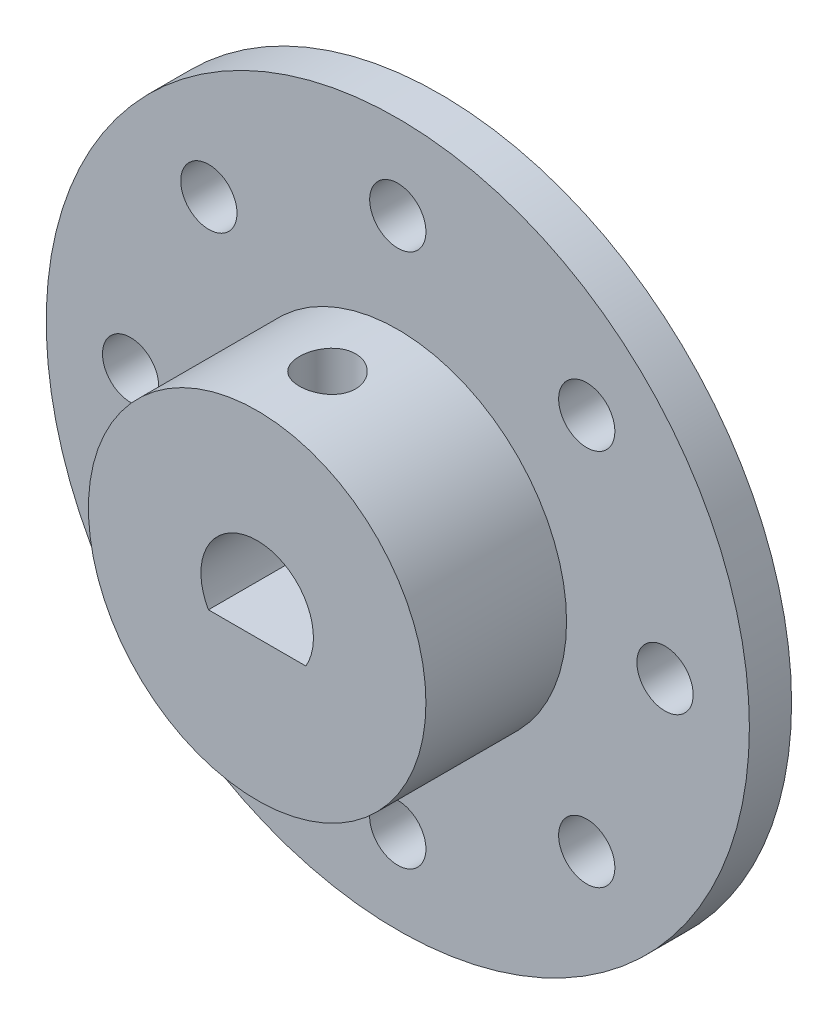
ISO-10303-21;
HEADER;
FILE_DESCRIPTION(('STEP AP214'),'2;1');
FILE_NAME('part.step','',(''),(''),'','','');
FILE_SCHEMA(('AUTOMOTIVE_DESIGN { 1 0 10303 214 1 1 1 1 }'));
ENDSEC;
DATA;
#1=APPLICATION_CONTEXT('core data for automotive mechanical design processes');
#2=APPLICATION_PROTOCOL_DEFINITION('international standard','automotive_design',2000,#1);
#3=PRODUCT_CONTEXT('',#1,'mechanical');
#4=PRODUCT('Part','Part','',(#3));
#5=PRODUCT_RELATED_PRODUCT_CATEGORY('part','',(#4));
#6=PRODUCT_DEFINITION_FORMATION('','',#4);
#7=PRODUCT_DEFINITION_CONTEXT('part definition',#1,'design');
#8=PRODUCT_DEFINITION('design','',#6,#7);
#9=PRODUCT_DEFINITION_SHAPE('','',#8);
#10=(LENGTH_UNIT() NAMED_UNIT(*) SI_UNIT(.MILLI.,.METRE.));
#11=(NAMED_UNIT(*) PLANE_ANGLE_UNIT() SI_UNIT($,.RADIAN.));
#12=(NAMED_UNIT(*) SI_UNIT($,.STERADIAN.) SOLID_ANGLE_UNIT());
#13=UNCERTAINTY_MEASURE_WITH_UNIT(LENGTH_MEASURE(1.E-05),#10,'distance_accuracy_value','');
#14=(GEOMETRIC_REPRESENTATION_CONTEXT(3) GLOBAL_UNCERTAINTY_ASSIGNED_CONTEXT((#13)) GLOBAL_UNIT_ASSIGNED_CONTEXT((#10,
#11,#12)) REPRESENTATION_CONTEXT('',''));
#15=CARTESIAN_POINT('',(0.,0.,0.));
#16=DIRECTION('',(0.,0.,1.));
#17=DIRECTION('',(1.,0.,0.));
#18=AXIS2_PLACEMENT_3D('',#15,#16,#17);
#19=CARTESIAN_POINT('',(0.,0.,3.));
#20=DIRECTION('',(0.,0.,-1.));
#21=DIRECTION('',(-1.,0.,0.));
#22=AXIS2_PLACEMENT_3D('',#19,#20,#21);
#23=CYLINDRICAL_SURFACE('',#22,4.);
#24=DIRECTION('',(0.,0.,1.));
#25=VECTOR('',#24,1.);
#26=CARTESIAN_POINT('',(-3.46410161513775,-2.,-11.));
#27=LINE('',#26,#25);
#28=CARTESIAN_POINT('',(-3.46410161513775,-2.,3.));
#29=VERTEX_POINT('',#28);
#30=CARTESIAN_POINT('',(-3.46410161513775,-2.,13.));
#31=VERTEX_POINT('',#30);
#32=EDGE_CURVE('E76',#29,#31,#27,.T.);
#33=ORIENTED_EDGE('',*,*,#32,.F.);
#34=CARTESIAN_POINT('',(0.,0.,3.));
#35=DIRECTION('',(0.,0.,1.));
#36=DIRECTION('',(1.,0.,0.));
#37=AXIS2_PLACEMENT_3D('',#34,#35,#36);
#38=CIRCLE('',#37,4.);
#39=CARTESIAN_POINT('',(3.46410161513775,-2.,3.));
#40=VERTEX_POINT('',#39);
#41=EDGE_CURVE('E73',#29,#40,#38,.T.);
#42=ORIENTED_EDGE('',*,*,#41,.T.);
#43=DIRECTION('',(0.,0.,1.));
#44=VECTOR('',#43,1.);
#45=CARTESIAN_POINT('',(3.46410161513775,-2.,-11.));
#46=LINE('',#45,#44);
#47=CARTESIAN_POINT('',(3.46410161513775,-2.,13.));
#48=VERTEX_POINT('',#47);
#49=EDGE_CURVE('E58',#40,#48,#46,.T.);
#50=ORIENTED_EDGE('',*,*,#49,.T.);
#51=CARTESIAN_POINT('',(0.,0.,13.));
#52=DIRECTION('',(0.,0.,1.));
#53=DIRECTION('',(1.,0.,0.));
#54=AXIS2_PLACEMENT_3D('',#51,#52,#53);
#55=CIRCLE('',#54,4.);
#56=EDGE_CURVE('E65',#48,#31,#55,.T.);
#57=ORIENTED_EDGE('',*,*,#56,.T.);
#58=EDGE_LOOP('',(#33,#42,#50,#57));
#59=FACE_BOUND('',#58,.T.);
#60=CARTESIAN_POINT('',(0.,0.,0.));
#61=DIRECTION('',(0.,0.,1.));
#62=DIRECTION('',(1.,0.,0.));
#63=AXIS2_PLACEMENT_3D('',#60,#61,#62);
#64=CIRCLE('',#63,4.);
#65=CARTESIAN_POINT('',(4.,0.,0.));
#66=VERTEX_POINT('',#65);
#67=EDGE_CURVE('E167',#66,#66,#64,.T.);
#68=ORIENTED_EDGE('',*,*,#67,.F.);
#69=EDGE_LOOP('',(#68));
#70=FACE_BOUND('',#69,.T.);
#71=CARTESIAN_POINT('',(0.,4.,6.));
#72=CARTESIAN_POINT('',(-0.10514392590247,3.99999426810082,6.00000660463438));
#73=CARTESIAN_POINT('',(-0.210413199395128,3.99580982039513,6.00834014624211));
#74=CARTESIAN_POINT('',(-0.417840470537796,3.97948312074314,6.04130576068308));
#75=CARTESIAN_POINT('',(-0.519992173427263,3.96732575657839,6.06596878599563));
#76=CARTESIAN_POINT('',(-0.717867089760901,3.93632558806751,6.13038761723326));
#77=CARTESIAN_POINT('',(-0.813613605878296,3.91750878355075,6.17008476849594));
#78=CARTESIAN_POINT('',(-0.996945233613201,3.87491553031523,6.26314124272997));
#79=CARTESIAN_POINT('',(-1.08453098798012,3.8511394726705,6.31649948849773));
#80=CARTESIAN_POINT('',(-1.25501563552382,3.79912516516124,6.43903449897057));
#81=CARTESIAN_POINT('',(-1.33731042224422,3.77070398255074,6.50897295847928));
#82=CARTESIAN_POINT('',(-1.48955888973396,3.71319940493486,6.66104295849407));
#83=CARTESIAN_POINT('',(-1.55950316621354,3.68411552418069,6.74318370354488));
#84=CARTESIAN_POINT('',(-1.69050400090056,3.62597902394695,6.92496669904676));
#85=CARTESIAN_POINT('',(-1.75045067110328,3.59710373940263,7.02547219669183));
#86=CARTESIAN_POINT('',(-1.8523364537814,3.54571957544641,7.23673467197243));
#87=CARTESIAN_POINT('',(-1.89428842993267,3.52320615213979,7.3474842574455));
#88=CARTESIAN_POINT('',(-1.95626488437718,3.48915734075617,7.56933021084385));
#89=CARTESIAN_POINT('',(-1.97745171416089,3.47704543167427,7.68000890413479));
#90=CARTESIAN_POINT('',(-2.0008539866177,3.46363779897055,7.90395767555896));
#91=CARTESIAN_POINT('',(-2.00308817674615,3.46233138686576,8.01722508174231));
#92=CARTESIAN_POINT('',(-1.98937457434459,3.47021860514497,8.22857204863074));
#93=CARTESIAN_POINT('',(-1.97556911907365,3.47817527324027,8.3268480624461));
#94=CARTESIAN_POINT('',(-1.93387969811387,3.501524574677,8.51944381874609));
#95=CARTESIAN_POINT('',(-1.90599124779531,3.51691957663552,8.61376229061063));
#96=CARTESIAN_POINT('',(-1.83641956077201,3.55374952825482,8.79845826513132));
#97=CARTESIAN_POINT('',(-1.79443013423199,3.57531681327997,8.88869279757158));
#98=CARTESIAN_POINT('',(-1.69808337533601,3.62206808562807,9.06126858518002));
#99=CARTESIAN_POINT('',(-1.64372048762494,3.64725369560381,9.14360627120018));
#100=CARTESIAN_POINT('',(-1.51613210982558,3.70226315806571,9.30904250548645));
#101=CARTESIAN_POINT('',(-1.44138891673857,3.73227020473492,9.39091374715232));
#102=CARTESIAN_POINT('',(-1.27911115748275,3.79095246600814,9.54147083718181));
#103=CARTESIAN_POINT('',(-1.19157051314857,3.81962703917602,9.61015038406777));
#104=CARTESIAN_POINT('',(-1.0010330116637,3.87403974565928,9.73537132205946));
#105=CARTESIAN_POINT('',(-0.897507183198821,3.89957968324014,9.79120094489148));
#106=CARTESIAN_POINT('',(-0.680932430977596,3.94315762242484,9.88419405808602));
#107=CARTESIAN_POINT('',(-0.567891152530555,3.96120157887106,9.92137237003033));
#108=CARTESIAN_POINT('',(-0.345532983321408,3.98648667482871,9.97295080743335));
#109=CARTESIAN_POINT('',(-0.236683061096656,3.9944987660262,9.98898247149356));
#110=CARTESIAN_POINT('',(-0.0175591998987065,4.00146026918207,10.002929462269));
#111=CARTESIAN_POINT('',(0.0927140397398144,4.00041397442637,10.0008533712789));
#112=CARTESIAN_POINT('',(0.302465943971971,3.9898238450687,9.97958662316251));
#113=CARTESIAN_POINT('',(0.402118816099857,3.98094491376337,9.96173493454001));
#114=CARTESIAN_POINT('',(0.596813784603879,3.95644342629681,9.91152385620976));
#115=CARTESIAN_POINT('',(0.691855371382171,3.94082012668824,9.87916286709301));
#116=CARTESIAN_POINT('',(0.877777216899143,3.90368502827176,9.80000306713393));
#117=CARTESIAN_POINT('',(0.968460794011604,3.88201763539262,9.75281789976742));
#118=CARTESIAN_POINT('',(1.14092272339854,3.83487948634835,9.64578492870686));
#119=CARTESIAN_POINT('',(1.22269725955318,3.80940711133877,9.58593173080921));
#120=CARTESIAN_POINT('',(1.38353537857843,3.75416442672396,9.44847914933857));
#121=CARTESIAN_POINT('',(1.46154415563805,3.72421769686999,9.3697142631097));
#122=CARTESIAN_POINT('',(1.60371264223771,3.6652478321764,9.20014969744454));
#123=CARTESIAN_POINT('',(1.66786277142374,3.63622534800094,9.10934176230416));
#124=CARTESIAN_POINT('',(1.78341582895803,3.58102384412979,8.91271269165405));
#125=CARTESIAN_POINT('',(1.83405099160049,3.55505059178122,8.80637746781104));
#126=CARTESIAN_POINT('',(1.9161656518694,3.5114814458827,8.58497986485007));
#127=CARTESIAN_POINT('',(1.94766983173403,3.493874764435,8.46992894706622));
#128=CARTESIAN_POINT('',(1.98772337493374,3.47123002051604,8.24617955423059));
#129=CARTESIAN_POINT('',(1.9981859928109,3.4651476693013,8.13793149312952));
#130=CARTESIAN_POINT('',(2.0013783087524,3.46330709283207,7.92110586567095));
#131=CARTESIAN_POINT('',(1.99411569324648,3.4675443925278,7.81252846252428));
#132=CARTESIAN_POINT('',(1.96385225118662,3.48475724102153,7.60903299693312));
#133=CARTESIAN_POINT('',(1.94241662868606,3.49686188965317,7.51379905971052));
#134=CARTESIAN_POINT('',(1.88635071644882,3.52742032375305,7.32838376115127));
#135=CARTESIAN_POINT('',(1.85171618231984,3.54587615139337,7.23820403581593));
#136=CARTESIAN_POINT('',(1.76763149060112,3.58857060729072,7.05875029802692));
#137=CARTESIAN_POINT('',(1.7173422756314,3.61311444791841,6.96994419634194));
#138=CARTESIAN_POINT('',(1.60430194327478,3.66470663269721,6.80145092763748));
#139=CARTESIAN_POINT('',(1.54154434248312,3.69175627591221,6.72176853895778));
#140=CARTESIAN_POINT('',(1.39640665332274,3.74924646316184,6.56371603529065));
#141=CARTESIAN_POINT('',(1.31256884599452,3.77969966613256,6.48668179529942));
#142=CARTESIAN_POINT('',(1.13230961246639,3.83755504519862,6.34747403312946));
#143=CARTESIAN_POINT('',(1.03588144661039,3.8649555725239,6.28530852106019));
#144=CARTESIAN_POINT('',(0.831863193565886,3.91396019133075,6.17752727457586));
#145=CARTESIAN_POINT('',(0.724199007553456,3.93552192987866,6.13203166152706));
#146=CARTESIAN_POINT('',(0.501484202276168,3.97002682597974,6.06038366448518));
#147=CARTESIAN_POINT('',(0.386455599178195,3.98299446726136,6.03417630638857));
#148=CARTESIAN_POINT('',(0.225203892981786,3.99390923826956,6.01220517782852));
#149=CARTESIAN_POINT('',(0.180323758883126,3.99618730680502,6.00763471826732));
#150=CARTESIAN_POINT('',(0.0903034636101798,3.99923393953631,6.00153066897183));
#151=CARTESIAN_POINT('',(0.0451632952932534,4.00000246206762,5.99999716305958));
#152=CARTESIAN_POINT('',(0.,4.,6.));
#153=B_SPLINE_CURVE_WITH_KNOTS('',3,(#71,#72,#73,#74,#75,#76,#77,#78,#79,#80,#81,#82,#83,#84,
#85,#86,#87,#88,#89,#90,#91,#92,#93,#94,#95,#96,#97,#98,#99,#100,#101,#102,#103,#104,#105,#106,
#107,#108,#109,#110,#111,#112,#113,#114,#115,#116,#117,#118,#119,#120,#121,#122,#123,#124,#125,
#126,#127,#128,#129,#130,#131,#132,#133,#134,#135,#136,#137,#138,#139,#140,#141,#142,#143,#144,
#145,#146,#147,#148,#149,#150,#151,#152),.UNSPECIFIED.,.T.,.F.,(4,2,2,2,2,2,2,2,2,2,2,2,2,2,2,2,
2,2,2,2,2,2,2,2,2,2,2,2,2,2,2,2,2,2,2,2,2,2,2,2,4),(0.,0.315248514840585,0.631096299418396,
0.945724310984597,1.26032752116314,1.59396351743618,1.92785247530807,2.28763452861506,
2.64715895796562,2.98516024280459,3.32282714658041,3.62011424818641,3.91749607851357,
4.22180480336975,4.52625042520444,4.86929882667757,5.21251069197373,5.57166044428881,
5.93052433824559,6.25966580942691,6.58865129022952,6.89213813012244,7.19565843261863,
7.50785712055797,7.82018901496679,8.16319221288838,8.50643177230864,8.86629364323452,
9.22569023890902,9.55058615006093,9.87534119729357,10.1691586049771,10.463070575767,
10.7767291356057,11.0905512228726,11.4425048551434,11.7946476676249,12.1492802732705,
12.502898172423,12.6383056026783,12.7737167702213),.UNSPECIFIED.);
#154=CARTESIAN_POINT('',(0.,4.,6.));
#155=VERTEX_POINT('',#154);
#156=EDGE_CURVE('E87',#155,#155,#153,.T.);
#157=ORIENTED_EDGE('',*,*,#156,.T.);
#158=EDGE_LOOP('',(#157));
#159=FACE_BOUND('',#158,.T.);
#160=ADVANCED_FACE('F42',(#59,#70,#159),#23,.F.);
#161=CARTESIAN_POINT('',(0.,0.,13.));
#162=DIRECTION('',(0.,0.,-1.));
#163=DIRECTION('',(-1.,0.,0.));
#164=AXIS2_PLACEMENT_3D('',#161,#162,#163);
#165=CYLINDRICAL_SURFACE('',#164,12.);
#166=CARTESIAN_POINT('',(0.,0.,13.));
#167=DIRECTION('',(0.,0.,1.));
#168=DIRECTION('',(1.,0.,0.));
#169=AXIS2_PLACEMENT_3D('',#166,#167,#168);
#170=CIRCLE('',#169,12.);
#171=CARTESIAN_POINT('',(12.,0.,13.));
#172=VERTEX_POINT('',#171);
#173=EDGE_CURVE('E105',#172,#172,#170,.T.);
#174=ORIENTED_EDGE('',*,*,#173,.F.);
#175=EDGE_LOOP('',(#174));
#176=FACE_BOUND('',#175,.T.);
#177=CARTESIAN_POINT('',(0.,0.,3.));
#178=DIRECTION('',(0.,0.,1.));
#179=DIRECTION('',(1.,0.,0.));
#180=AXIS2_PLACEMENT_3D('',#177,#178,#179);
#181=CIRCLE('',#180,12.);
#182=CARTESIAN_POINT('',(12.,0.,3.));
#183=VERTEX_POINT('',#182);
#184=EDGE_CURVE('E104',#183,#183,#181,.T.);
#185=ORIENTED_EDGE('',*,*,#184,.T.);
#186=EDGE_LOOP('',(#185));
#187=FACE_BOUND('',#186,.T.);
#188=CARTESIAN_POINT('',(0.,12.,6.));
#189=CARTESIAN_POINT('',(-0.111512723966575,11.9999980893506,6.00000447115825));
#190=CARTESIAN_POINT('',(-0.22308630547106,11.9984294233043,6.00935781997514));
#191=CARTESIAN_POINT('',(-0.443104177338437,11.9923227595311,6.04650852701226));
#192=CARTESIAN_POINT('',(-0.551545494367401,11.9877820313911,6.07432284552928));
#193=CARTESIAN_POINT('',(-0.762083797770118,11.9762405458916,6.1475323588742));
#194=CARTESIAN_POINT('',(-0.864185894745523,11.9692418012735,6.19291317251246));
#195=CARTESIAN_POINT('',(-1.05931347358236,11.9535538166566,6.29992983364192));
#196=CARTESIAN_POINT('',(-1.15233999190288,11.9448647700355,6.3615638219864));
#197=CARTESIAN_POINT('',(-1.32757809143335,11.9266665396665,6.49996406705637));
#198=CARTESIAN_POINT('',(-1.40969032282798,11.9171509745189,6.5768552917089));
#199=CARTESIAN_POINT('',(-1.55991079892794,11.8984210150139,6.74331837477825));
#200=CARTESIAN_POINT('',(-1.62801815951278,11.8892066397013,6.83289103316529));
#201=CARTESIAN_POINT('',(-1.74869370048411,11.8720605260782,7.02285677295764));
#202=CARTESIAN_POINT('',(-1.8011636422888,11.8641370327331,7.1233130694438));
#203=CARTESIAN_POINT('',(-1.88844669232898,11.8505583183574,7.3317676514405));
#204=CARTESIAN_POINT('',(-1.92326099325249,11.8449029441145,7.4397654269421));
#205=CARTESIAN_POINT('',(-1.97393150222785,11.836564294742,7.65918421988523));
#206=CARTESIAN_POINT('',(-1.98995922330832,11.8338541478856,7.77056458920111));
#207=CARTESIAN_POINT('',(-2.0031333802319,11.8316315114932,7.99446422150677));
#208=CARTESIAN_POINT('',(-2.0002811523112,11.8321187956577,8.10698340333384));
#209=CARTESIAN_POINT('',(-1.97591607871692,11.8362114309084,8.32874228902036));
#210=CARTESIAN_POINT('',(-1.95459590551182,11.8397845865513,8.43800384283618));
#211=CARTESIAN_POINT('',(-1.89420251232276,11.8495959616881,8.65137705426331));
#212=CARTESIAN_POINT('',(-1.8551286834558,11.8558342725862,8.75548853511084));
#213=CARTESIAN_POINT('',(-1.76014179687513,11.8703078346728,8.95618305875274));
#214=CARTESIAN_POINT('',(-1.70414873110378,11.8785525368586,9.05272752486498));
#215=CARTESIAN_POINT('',(-1.57696961404595,11.8961033473201,9.23512352043071));
#216=CARTESIAN_POINT('',(-1.50578233652343,11.9054095412343,9.32097418596394));
#217=CARTESIAN_POINT('',(-1.34918576972725,11.9241762230383,9.48066086864588));
#218=CARTESIAN_POINT('',(-1.26361117109851,11.9336371938532,9.55433481483207));
#219=CARTESIAN_POINT('',(-1.08122819918532,11.9515408111738,9.68630221013227));
#220=CARTESIAN_POINT('',(-0.984419753525141,11.959983451118,9.74459556014658));
#221=CARTESIAN_POINT('',(-0.782164732933373,11.9749111431433,9.84416178170903));
#222=CARTESIAN_POINT('',(-0.676710980451733,11.9813945472596,9.885420335465));
#223=CARTESIAN_POINT('',(-0.46023867648219,11.9916600241013,9.94959537219678));
#224=CARTESIAN_POINT('',(-0.349220591343579,11.9954423228038,9.97251338957897));
#225=CARTESIAN_POINT('',(-0.126167921041303,11.9998490387415,9.99913708676891));
#226=CARTESIAN_POINT('',(-0.0141605897208129,12.0005100241023,10.0030652574445));
#227=CARTESIAN_POINT('',(0.208911818311906,11.9986997953694,9.9921909244575));
#228=CARTESIAN_POINT('',(0.319976931113627,11.9962287017929,9.97738914149301));
#229=CARTESIAN_POINT('',(0.537324940437407,11.9884546155056,9.92966012053162));
#230=CARTESIAN_POINT('',(0.6436326947083,11.9831688384105,9.8968430332879));
#231=CARTESIAN_POINT('',(0.849237507888351,11.9703557156429,9.81413238544037));
#232=CARTESIAN_POINT('',(0.948534172727772,11.9628282440962,9.76423786589178));
#233=CARTESIAN_POINT('',(1.13826455157516,11.9462761304193,9.64827910024257));
#234=CARTESIAN_POINT('',(1.22861220074971,11.9372388470962,9.5820758750662));
#235=CARTESIAN_POINT('',(1.39699486840215,11.9187077391352,9.43557014769195));
#236=CARTESIAN_POINT('',(1.47502899175726,11.9092138813724,9.35526662137866));
#237=CARTESIAN_POINT('',(1.6173942237264,11.8907214018868,9.18184196154286));
#238=CARTESIAN_POINT('',(1.68157500889097,11.8817289290968,9.08859666758847));
#239=CARTESIAN_POINT('',(1.79336184823598,11.8653722382231,8.89251762468917));
#240=CARTESIAN_POINT('',(1.84096842781585,11.8580079685282,8.78968417981801));
#241=CARTESIAN_POINT('',(1.91803066517852,11.8457876295816,8.57776821375029));
#242=CARTESIAN_POINT('',(1.94756114603835,11.8409212344885,8.46871352397561));
#243=CARTESIAN_POINT('',(1.98786836302262,11.8342217346821,8.24710389662259));
#244=CARTESIAN_POINT('',(1.99864672955693,11.8323883662618,8.13454926421436));
#245=CARTESIAN_POINT('',(2.00109829283788,11.8319738646721,7.91063586723008));
#246=CARTESIAN_POINT('',(1.99300810890015,11.8333524520452,7.79927969713977));
#247=CARTESIAN_POINT('',(1.95846387116548,11.8391182516298,7.57953660155939));
#248=CARTESIAN_POINT('',(1.93200987688998,11.8435054540897,7.4711496664465));
#249=CARTESIAN_POINT('',(1.86157959167592,11.8547788502538,7.26051325016591));
#250=CARTESIAN_POINT('',(1.81762367248035,11.8616621377574,7.15825679195518));
#251=CARTESIAN_POINT('',(1.71346160313272,11.8771549513777,6.96253146464412));
#252=CARTESIAN_POINT('',(1.65325464699885,11.8857645631072,6.86906303170229));
#253=CARTESIAN_POINT('',(1.51745510749772,11.903867632365,6.6923715335138));
#254=CARTESIAN_POINT('',(1.44168845087492,11.9133703646104,6.60928318663978));
#255=CARTESIAN_POINT('',(1.27728722510418,11.9321149788867,6.45691871642005));
#256=CARTESIAN_POINT('',(1.18864969033011,11.9413568002124,6.38764578508946));
#257=CARTESIAN_POINT('',(1.00029533571222,11.9586122371378,6.26444138544004));
#258=CARTESIAN_POINT('',(0.900506230026252,11.9666169300248,6.21061916854964));
#259=CARTESIAN_POINT('',(0.693210455503182,11.9804093408142,6.12058441231206));
#260=CARTESIAN_POINT('',(0.585711595864004,11.9861992654199,6.08435433513624));
#261=CARTESIAN_POINT('',(0.398162648036317,11.9936463266636,6.03839578069867));
#262=CARTESIAN_POINT('',(0.319247064238754,11.9960162181869,6.02402042430723));
#263=CARTESIAN_POINT('',(0.160231448255844,11.999193727889,6.0048210097242));
#264=CARTESIAN_POINT('',(0.0801314364867918,12.0000013729651,5.99999678709011));
#265=CARTESIAN_POINT('',(0.,12.,6.));
#266=B_SPLINE_CURVE_WITH_KNOTS('',3,(#188,#189,#190,#191,#192,#193,#194,#195,#196,#197,#198,
#199,#200,#201,#202,#203,#204,#205,#206,#207,#208,#209,#210,#211,#212,#213,#214,#215,#216,#217,
#218,#219,#220,#221,#222,#223,#224,#225,#226,#227,#228,#229,#230,#231,#232,#233,#234,#235,#236,
#237,#238,#239,#240,#241,#242,#243,#244,#245,#246,#247,#248,#249,#250,#251,#252,#253,#254,#255,
#256,#257,#258,#259,#260,#261,#262,#263,#264,#265),.UNSPECIFIED.,.T.,.F.,(4,2,2,2,2,2,2,2,2,2,2,
2,2,2,2,2,2,2,2,2,2,2,2,2,2,2,2,2,2,2,2,2,2,2,2,2,2,2,4),(0.,0.334245267950807,
0.668798036556336,1.00307749362022,1.33731873013983,1.67441992849866,2.01154240135885,
2.35074016659072,2.68991501500945,3.02596861682739,3.36199843456709,3.69456417408327,
4.02714132020305,4.36131645306046,4.69551856544459,5.03386215929061,5.37220793308678,
5.71083751132723,6.04943875616919,6.38406306793118,6.71867450428688,7.05126245605132,
7.38386908660853,7.71941460501619,8.05498450443426,8.39403057606095,8.73306589900754,
9.07068817873418,9.40828110229294,9.7416632761816,10.0750443695051,10.4080385458098,
10.7410492402347,11.0780110735471,11.4150506710318,11.7544178528576,12.0934460170406,
12.3336339853121,12.5738178182157),.UNSPECIFIED.);
#267=CARTESIAN_POINT('',(0.,12.,6.));
#268=VERTEX_POINT('',#267);
#269=EDGE_CURVE('E91',#268,#268,#266,.T.);
#270=ORIENTED_EDGE('',*,*,#269,.F.);
#271=EDGE_LOOP('',(#270));
#272=FACE_BOUND('',#271,.T.);
#273=ADVANCED_FACE('F201',(#176,#187,#272),#165,.T.);
#274=CARTESIAN_POINT('',(0.,0.,3.));
#275=DIRECTION('',(0.,0.,1.));
#276=DIRECTION('',(1.,0.,0.));
#277=AXIS2_PLACEMENT_3D('',#274,#275,#276);
#278=PLANE('',#277);
#279=ORIENTED_EDGE('',*,*,#184,.F.);
#280=EDGE_LOOP('',(#279));
#281=FACE_BOUND('',#280,.T.);
#282=CARTESIAN_POINT('',(-19.,1.99014436314059E-13,3.));
#283=DIRECTION('',(0.,0.,1.));
#284=DIRECTION('',(1.,0.,0.));
#285=AXIS2_PLACEMENT_3D('',#282,#283,#284);
#286=CIRCLE('',#285,2.);
#287=CARTESIAN_POINT('',(-17.,1.99014436314059E-13,3.));
#288=VERTEX_POINT('',#287);
#289=EDGE_CURVE('E123',#288,#288,#286,.T.);
#290=ORIENTED_EDGE('',*,*,#289,.F.);
#291=EDGE_LOOP('',(#290));
#292=FACE_BOUND('',#291,.T.);
#293=CARTESIAN_POINT('',(-1.32676290876039E-13,-19.,3.));
#294=DIRECTION('',(0.,0.,1.));
#295=DIRECTION('',(1.,0.,0.));
#296=AXIS2_PLACEMENT_3D('',#293,#294,#295);
#297=CIRCLE('',#296,2.);
#298=CARTESIAN_POINT('',(1.99999999999987,-19.,3.));
#299=VERTEX_POINT('',#298);
#300=EDGE_CURVE('E139',#299,#299,#297,.T.);
#301=ORIENTED_EDGE('',*,*,#300,.F.);
#302=EDGE_LOOP('',(#301));
#303=FACE_BOUND('',#302,.T.);
#304=CARTESIAN_POINT('',(19.,0.,3.));
#305=DIRECTION('',(0.,0.,1.));
#306=DIRECTION('',(1.,0.,0.));
#307=AXIS2_PLACEMENT_3D('',#304,#305,#306);
#308=CIRCLE('',#307,2.);
#309=CARTESIAN_POINT('',(21.,0.,3.));
#310=VERTEX_POINT('',#309);
#311=EDGE_CURVE('E155',#310,#310,#308,.T.);
#312=ORIENTED_EDGE('',*,*,#311,.F.);
#313=EDGE_LOOP('',(#312));
#314=FACE_BOUND('',#313,.T.);
#315=CARTESIAN_POINT('',(0.,0.,3.));
#316=DIRECTION('',(0.,0.,1.));
#317=DIRECTION('',(1.,0.,0.));
#318=AXIS2_PLACEMENT_3D('',#315,#316,#317);
#319=CIRCLE('',#318,25.);
#320=CARTESIAN_POINT('',(25.,0.,3.));
#321=VERTEX_POINT('',#320);
#322=EDGE_CURVE('E11',#321,#321,#319,.T.);
#323=ORIENTED_EDGE('',*,*,#322,.T.);
#324=EDGE_LOOP('',(#323));
#325=FACE_BOUND('',#324,.T.);
#326=CARTESIAN_POINT('',(0.,19.,3.));
#327=DIRECTION('',(0.,0.,1.));
#328=DIRECTION('',(1.,0.,0.));
#329=AXIS2_PLACEMENT_3D('',#326,#327,#328);
#330=CIRCLE('',#329,2.);
#331=CARTESIAN_POINT('',(2.,19.,3.));
#332=VERTEX_POINT('',#331);
#333=EDGE_CURVE('E175',#332,#332,#330,.T.);
#334=ORIENTED_EDGE('',*,*,#333,.F.);
#335=EDGE_LOOP('',(#334));
#336=FACE_BOUND('',#335,.T.);
#337=CARTESIAN_POINT('',(13.4350288425444,13.4350288425444,3.));
#338=DIRECTION('',(0.,0.,1.));
#339=DIRECTION('',(1.,0.,0.));
#340=AXIS2_PLACEMENT_3D('',#337,#338,#339);
#341=CIRCLE('',#340,2.);
#342=CARTESIAN_POINT('',(15.4350288425444,13.4350288425444,3.));
#343=VERTEX_POINT('',#342);
#344=EDGE_CURVE('E163',#343,#343,#341,.T.);
#345=ORIENTED_EDGE('',*,*,#344,.F.);
#346=EDGE_LOOP('',(#345));
#347=FACE_BOUND('',#346,.T.);
#348=CARTESIAN_POINT('',(13.4350288425443,-13.4350288425445,3.));
#349=DIRECTION('',(0.,0.,1.));
#350=DIRECTION('',(1.,0.,0.));
#351=AXIS2_PLACEMENT_3D('',#348,#349,#350);
#352=CIRCLE('',#351,2.);
#353=CARTESIAN_POINT('',(15.4350288425443,-13.4350288425445,3.));
#354=VERTEX_POINT('',#353);
#355=EDGE_CURVE('E147',#354,#354,#352,.T.);
#356=ORIENTED_EDGE('',*,*,#355,.F.);
#357=EDGE_LOOP('',(#356));
#358=FACE_BOUND('',#357,.T.);
#359=CARTESIAN_POINT('',(-13.4350288425445,-13.4350288425443,3.));
#360=DIRECTION('',(0.,0.,1.));
#361=DIRECTION('',(1.,0.,0.));
#362=AXIS2_PLACEMENT_3D('',#359,#360,#361);
#363=CIRCLE('',#362,2.);
#364=CARTESIAN_POINT('',(-11.4350288425445,-13.4350288425443,3.));
#365=VERTEX_POINT('',#364);
#366=EDGE_CURVE('E131',#365,#365,#363,.T.);
#367=ORIENTED_EDGE('',*,*,#366,.F.);
#368=EDGE_LOOP('',(#367));
#369=FACE_BOUND('',#368,.T.);
#370=CARTESIAN_POINT('',(-13.4350288425442,13.4350288425446,3.));
#371=DIRECTION('',(0.,0.,1.));
#372=DIRECTION('',(1.,0.,0.));
#373=AXIS2_PLACEMENT_3D('',#370,#371,#372);
#374=CIRCLE('',#373,2.);
#375=CARTESIAN_POINT('',(-11.4350288425442,13.4350288425446,3.));
#376=VERTEX_POINT('',#375);
#377=EDGE_CURVE('E115',#376,#376,#374,.T.);
#378=ORIENTED_EDGE('',*,*,#377,.F.);
#379=EDGE_LOOP('',(#378));
#380=FACE_BOUND('',#379,.T.);
#381=ADVANCED_FACE('F206',(#281,#292,#303,#314,#325,#336,#347,#358,#369,#380),#278,.T.);
#382=CARTESIAN_POINT('',(0.,0.,0.));
#383=DIRECTION('',(0.,0.,1.));
#384=DIRECTION('',(1.,0.,0.));
#385=AXIS2_PLACEMENT_3D('',#382,#383,#384);
#386=PLANE('',#385);
#387=CARTESIAN_POINT('',(0.,0.,0.));
#388=DIRECTION('',(0.,0.,1.));
#389=DIRECTION('',(1.,0.,0.));
#390=AXIS2_PLACEMENT_3D('',#387,#388,#389);
#391=CIRCLE('',#390,25.);
#392=CARTESIAN_POINT('',(25.,0.,0.));
#393=VERTEX_POINT('',#392);
#394=EDGE_CURVE('E46',#393,#393,#391,.T.);
#395=ORIENTED_EDGE('',*,*,#394,.F.);
#396=EDGE_LOOP('',(#395));
#397=FACE_BOUND('',#396,.T.);
#398=CARTESIAN_POINT('',(0.,19.,0.));
#399=DIRECTION('',(0.,0.,1.));
#400=DIRECTION('',(1.,0.,0.));
#401=AXIS2_PLACEMENT_3D('',#398,#399,#400);
#402=CIRCLE('',#401,2.);
#403=CARTESIAN_POINT('',(2.,19.,0.));
#404=VERTEX_POINT('',#403);
#405=EDGE_CURVE('E174',#404,#404,#402,.T.);
#406=ORIENTED_EDGE('',*,*,#405,.T.);
#407=EDGE_LOOP('',(#406));
#408=FACE_BOUND('',#407,.T.);
#409=ORIENTED_EDGE('',*,*,#67,.T.);
#410=EDGE_LOOP('',(#409));
#411=FACE_BOUND('',#410,.T.);
#412=CARTESIAN_POINT('',(13.4350288425444,13.4350288425444,0.));
#413=DIRECTION('',(0.,0.,1.));
#414=DIRECTION('',(1.,0.,0.));
#415=AXIS2_PLACEMENT_3D('',#412,#413,#414);
#416=CIRCLE('',#415,2.);
#417=CARTESIAN_POINT('',(15.4350288425444,13.4350288425444,0.));
#418=VERTEX_POINT('',#417);
#419=EDGE_CURVE('E159',#418,#418,#416,.T.);
#420=ORIENTED_EDGE('',*,*,#419,.T.);
#421=EDGE_LOOP('',(#420));
#422=FACE_BOUND('',#421,.T.);
#423=CARTESIAN_POINT('',(19.,0.,0.));
#424=DIRECTION('',(0.,0.,1.));
#425=DIRECTION('',(1.,0.,0.));
#426=AXIS2_PLACEMENT_3D('',#423,#424,#425);
#427=CIRCLE('',#426,2.);
#428=CARTESIAN_POINT('',(21.,0.,0.));
#429=VERTEX_POINT('',#428);
#430=EDGE_CURVE('E151',#429,#429,#427,.T.);
#431=ORIENTED_EDGE('',*,*,#430,.T.);
#432=EDGE_LOOP('',(#431));
#433=FACE_BOUND('',#432,.T.);
#434=CARTESIAN_POINT('',(13.4350288425443,-13.4350288425445,0.));
#435=DIRECTION('',(0.,0.,1.));
#436=DIRECTION('',(1.,0.,0.));
#437=AXIS2_PLACEMENT_3D('',#434,#435,#436);
#438=CIRCLE('',#437,2.);
#439=CARTESIAN_POINT('',(15.4350288425443,-13.4350288425445,0.));
#440=VERTEX_POINT('',#439);
#441=EDGE_CURVE('E143',#440,#440,#438,.T.);
#442=ORIENTED_EDGE('',*,*,#441,.T.);
#443=EDGE_LOOP('',(#442));
#444=FACE_BOUND('',#443,.T.);
#445=CARTESIAN_POINT('',(-1.32676290876039E-13,-19.,0.));
#446=DIRECTION('',(0.,0.,1.));
#447=DIRECTION('',(1.,0.,0.));
#448=AXIS2_PLACEMENT_3D('',#445,#446,#447);
#449=CIRCLE('',#448,2.);
#450=CARTESIAN_POINT('',(1.99999999999987,-19.,0.));
#451=VERTEX_POINT('',#450);
#452=EDGE_CURVE('E135',#451,#451,#449,.T.);
#453=ORIENTED_EDGE('',*,*,#452,.T.);
#454=EDGE_LOOP('',(#453));
#455=FACE_BOUND('',#454,.T.);
#456=CARTESIAN_POINT('',(-13.4350288425445,-13.4350288425443,0.));
#457=DIRECTION('',(0.,0.,1.));
#458=DIRECTION('',(1.,0.,0.));
#459=AXIS2_PLACEMENT_3D('',#456,#457,#458);
#460=CIRCLE('',#459,2.);
#461=CARTESIAN_POINT('',(-11.4350288425445,-13.4350288425443,0.));
#462=VERTEX_POINT('',#461);
#463=EDGE_CURVE('E127',#462,#462,#460,.T.);
#464=ORIENTED_EDGE('',*,*,#463,.T.);
#465=EDGE_LOOP('',(#464));
#466=FACE_BOUND('',#465,.T.);
#467=CARTESIAN_POINT('',(-19.,1.99014436314059E-13,0.));
#468=DIRECTION('',(0.,0.,1.));
#469=DIRECTION('',(1.,0.,0.));
#470=AXIS2_PLACEMENT_3D('',#467,#468,#469);
#471=CIRCLE('',#470,2.);
#472=CARTESIAN_POINT('',(-17.,1.99014436314059E-13,0.));
#473=VERTEX_POINT('',#472);
#474=EDGE_CURVE('E119',#473,#473,#471,.T.);
#475=ORIENTED_EDGE('',*,*,#474,.T.);
#476=EDGE_LOOP('',(#475));
#477=FACE_BOUND('',#476,.T.);
#478=CARTESIAN_POINT('',(-13.4350288425442,13.4350288425446,0.));
#479=DIRECTION('',(0.,0.,1.));
#480=DIRECTION('',(1.,0.,0.));
#481=AXIS2_PLACEMENT_3D('',#478,#479,#480);
#482=CIRCLE('',#481,2.);
#483=CARTESIAN_POINT('',(-11.4350288425442,13.4350288425446,0.));
#484=VERTEX_POINT('',#483);
#485=EDGE_CURVE('E114',#484,#484,#482,.T.);
#486=ORIENTED_EDGE('',*,*,#485,.T.);
#487=EDGE_LOOP('',(#486));
#488=FACE_BOUND('',#487,.T.);
#489=ADVANCED_FACE('F183',(#397,#408,#411,#422,#433,#444,#455,#466,#477,#488),#386,.F.);
#490=CARTESIAN_POINT('',(0.,0.,3.));
#491=DIRECTION('',(0.,0.,-1.));
#492=DIRECTION('',(-1.,0.,0.));
#493=AXIS2_PLACEMENT_3D('',#490,#491,#492);
#494=CYLINDRICAL_SURFACE('',#493,25.);
#495=ORIENTED_EDGE('',*,*,#322,.F.);
#496=EDGE_LOOP('',(#495));
#497=FACE_BOUND('',#496,.T.);
#498=ORIENTED_EDGE('',*,*,#394,.T.);
#499=EDGE_LOOP('',(#498));
#500=FACE_BOUND('',#499,.T.);
#501=ADVANCED_FACE('F44',(#497,#500),#494,.T.);
#502=CARTESIAN_POINT('',(0.,19.,3.));
#503=DIRECTION('',(0.,0.,-1.));
#504=DIRECTION('',(-1.,0.,0.));
#505=AXIS2_PLACEMENT_3D('',#502,#503,#504);
#506=CYLINDRICAL_SURFACE('',#505,2.);
#507=ORIENTED_EDGE('',*,*,#333,.T.);
#508=EDGE_LOOP('',(#507));
#509=FACE_BOUND('',#508,.T.);
#510=ORIENTED_EDGE('',*,*,#405,.F.);
#511=EDGE_LOOP('',(#510));
#512=FACE_BOUND('',#511,.T.);
#513=ADVANCED_FACE('F186',(#509,#512),#506,.F.);
#514=CARTESIAN_POINT('',(13.4350288425444,13.4350288425444,3.));
#515=DIRECTION('',(0.,0.,-1.));
#516=DIRECTION('',(-1.,0.,0.));
#517=AXIS2_PLACEMENT_3D('',#514,#515,#516);
#518=CYLINDRICAL_SURFACE('',#517,2.);
#519=ORIENTED_EDGE('',*,*,#344,.T.);
#520=EDGE_LOOP('',(#519));
#521=FACE_BOUND('',#520,.T.);
#522=ORIENTED_EDGE('',*,*,#419,.F.);
#523=EDGE_LOOP('',(#522));
#524=FACE_BOUND('',#523,.T.);
#525=ADVANCED_FACE('F188',(#521,#524),#518,.F.);
#526=CARTESIAN_POINT('',(19.,0.,3.));
#527=DIRECTION('',(0.,0.,-1.));
#528=DIRECTION('',(-1.,0.,0.));
#529=AXIS2_PLACEMENT_3D('',#526,#527,#528);
#530=CYLINDRICAL_SURFACE('',#529,2.);
#531=ORIENTED_EDGE('',*,*,#311,.T.);
#532=EDGE_LOOP('',(#531));
#533=FACE_BOUND('',#532,.T.);
#534=ORIENTED_EDGE('',*,*,#430,.F.);
#535=EDGE_LOOP('',(#534));
#536=FACE_BOUND('',#535,.T.);
#537=ADVANCED_FACE('F195',(#533,#536),#530,.F.);
#538=CARTESIAN_POINT('',(13.4350288425443,-13.4350288425445,3.));
#539=DIRECTION('',(0.,0.,-1.));
#540=DIRECTION('',(-1.,0.,0.));
#541=AXIS2_PLACEMENT_3D('',#538,#539,#540);
#542=CYLINDRICAL_SURFACE('',#541,2.);
#543=ORIENTED_EDGE('',*,*,#355,.T.);
#544=EDGE_LOOP('',(#543));
#545=FACE_BOUND('',#544,.T.);
#546=ORIENTED_EDGE('',*,*,#441,.F.);
#547=EDGE_LOOP('',(#546));
#548=FACE_BOUND('',#547,.T.);
#549=ADVANCED_FACE('F213',(#545,#548),#542,.F.);
#550=CARTESIAN_POINT('',(-1.32676290876039E-13,-19.,3.));
#551=DIRECTION('',(0.,0.,-1.));
#552=DIRECTION('',(-1.,0.,0.));
#553=AXIS2_PLACEMENT_3D('',#550,#551,#552);
#554=CYLINDRICAL_SURFACE('',#553,2.);
#555=ORIENTED_EDGE('',*,*,#300,.T.);
#556=EDGE_LOOP('',(#555));
#557=FACE_BOUND('',#556,.T.);
#558=ORIENTED_EDGE('',*,*,#452,.F.);
#559=EDGE_LOOP('',(#558));
#560=FACE_BOUND('',#559,.T.);
#561=ADVANCED_FACE('F217',(#557,#560),#554,.F.);
#562=CARTESIAN_POINT('',(-13.4350288425445,-13.4350288425443,3.));
#563=DIRECTION('',(0.,0.,-1.));
#564=DIRECTION('',(-1.,0.,0.));
#565=AXIS2_PLACEMENT_3D('',#562,#563,#564);
#566=CYLINDRICAL_SURFACE('',#565,2.);
#567=ORIENTED_EDGE('',*,*,#366,.T.);
#568=EDGE_LOOP('',(#567));
#569=FACE_BOUND('',#568,.T.);
#570=ORIENTED_EDGE('',*,*,#463,.F.);
#571=EDGE_LOOP('',(#570));
#572=FACE_BOUND('',#571,.T.);
#573=ADVANCED_FACE('F221',(#569,#572),#566,.F.);
#574=CARTESIAN_POINT('',(-19.,1.99014436314059E-13,3.));
#575=DIRECTION('',(0.,0.,-1.));
#576=DIRECTION('',(-1.,0.,0.));
#577=AXIS2_PLACEMENT_3D('',#574,#575,#576);
#578=CYLINDRICAL_SURFACE('',#577,2.);
#579=ORIENTED_EDGE('',*,*,#289,.T.);
#580=EDGE_LOOP('',(#579));
#581=FACE_BOUND('',#580,.T.);
#582=ORIENTED_EDGE('',*,*,#474,.F.);
#583=EDGE_LOOP('',(#582));
#584=FACE_BOUND('',#583,.T.);
#585=ADVANCED_FACE('F225',(#581,#584),#578,.F.);
#586=CARTESIAN_POINT('',(-13.4350288425442,13.4350288425446,3.));
#587=DIRECTION('',(0.,0.,-1.));
#588=DIRECTION('',(-1.,0.,0.));
#589=AXIS2_PLACEMENT_3D('',#586,#587,#588);
#590=CYLINDRICAL_SURFACE('',#589,2.);
#591=ORIENTED_EDGE('',*,*,#377,.T.);
#592=EDGE_LOOP('',(#591));
#593=FACE_BOUND('',#592,.T.);
#594=ORIENTED_EDGE('',*,*,#485,.F.);
#595=EDGE_LOOP('',(#594));
#596=FACE_BOUND('',#595,.T.);
#597=ADVANCED_FACE('F229',(#593,#596),#590,.F.);
#598=CARTESIAN_POINT('',(0.,0.,3.));
#599=DIRECTION('',(0.,0.,1.));
#600=DIRECTION('',(1.,0.,0.));
#601=AXIS2_PLACEMENT_3D('',#598,#599,#600);
#602=PLANE('',#601);
#603=ORIENTED_EDGE('',*,*,#41,.F.);
#604=DIRECTION('',(1.,0.,0.));
#605=VECTOR('',#604,1.);
#606=CARTESIAN_POINT('',(0.,-2.,3.));
#607=LINE('',#606,#605);
#608=EDGE_CURVE('E75',#29,#40,#607,.T.);
#609=ORIENTED_EDGE('',*,*,#608,.T.);
#610=EDGE_LOOP('',(#603,#609));
#611=FACE_BOUND('',#610,.T.);
#612=ADVANCED_FACE('F232',(#611),#602,.F.);
#613=CARTESIAN_POINT('',(0.,0.,13.));
#614=DIRECTION('',(0.,0.,1.));
#615=DIRECTION('',(1.,0.,0.));
#616=AXIS2_PLACEMENT_3D('',#613,#614,#615);
#617=PLANE('',#616);
#618=ORIENTED_EDGE('',*,*,#56,.F.);
#619=DIRECTION('',(1.,0.,0.));
#620=VECTOR('',#619,1.);
#621=CARTESIAN_POINT('',(-3.46410161513775,-2.,13.));
#622=LINE('',#621,#620);
#623=EDGE_CURVE('E79',#31,#48,#622,.T.);
#624=ORIENTED_EDGE('',*,*,#623,.F.);
#625=EDGE_LOOP('',(#618,#624));
#626=FACE_BOUND('',#625,.T.);
#627=ORIENTED_EDGE('',*,*,#173,.T.);
#628=EDGE_LOOP('',(#627));
#629=FACE_BOUND('',#628,.T.);
#630=ADVANCED_FACE('F84',(#626,#629),#617,.T.);
#631=CARTESIAN_POINT('',(-3.46410161513775,-2.,-11.));
#632=DIRECTION('',(0.,-1.,0.));
#633=DIRECTION('',(0.,0.,-1.));
#634=AXIS2_PLACEMENT_3D('',#631,#632,#633);
#635=PLANE('',#634);
#636=ORIENTED_EDGE('',*,*,#32,.T.);
#637=ORIENTED_EDGE('',*,*,#623,.T.);
#638=ORIENTED_EDGE('',*,*,#49,.F.);
#639=ORIENTED_EDGE('',*,*,#608,.F.);
#640=EDGE_LOOP('',(#636,#637,#638,#639));
#641=FACE_BOUND('',#640,.T.);
#642=ADVANCED_FACE('F80',(#641),#635,.F.);
#643=CARTESIAN_POINT('',(0.,17.,8.));
#644=DIRECTION('',(0.,-1.,0.));
#645=DIRECTION('',(0.,0.,-1.));
#646=AXIS2_PLACEMENT_3D('',#643,#644,#645);
#647=CYLINDRICAL_SURFACE('',#646,2.);
#648=ORIENTED_EDGE('',*,*,#156,.F.);
#649=EDGE_LOOP('',(#648));
#650=FACE_BOUND('',#649,.T.);
#651=ORIENTED_EDGE('',*,*,#269,.T.);
#652=EDGE_LOOP('',(#651));
#653=FACE_BOUND('',#652,.T.);
#654=ADVANCED_FACE('F242',(#650,#653),#647,.F.);
#655=CLOSED_SHELL('',(#160,#273,#381,#489,#501,#513,#525,#537,#549,#561,#573,#585,#597,#612,
#630,#642,#654));
#656=MANIFOLD_SOLID_BREP('B2',#655);
#657=ADVANCED_BREP_SHAPE_REPRESENTATION('',(#18,#656),#14);
#658=SHAPE_DEFINITION_REPRESENTATION(#9,#657);
ENDSEC;
END-ISO-10303-21;
